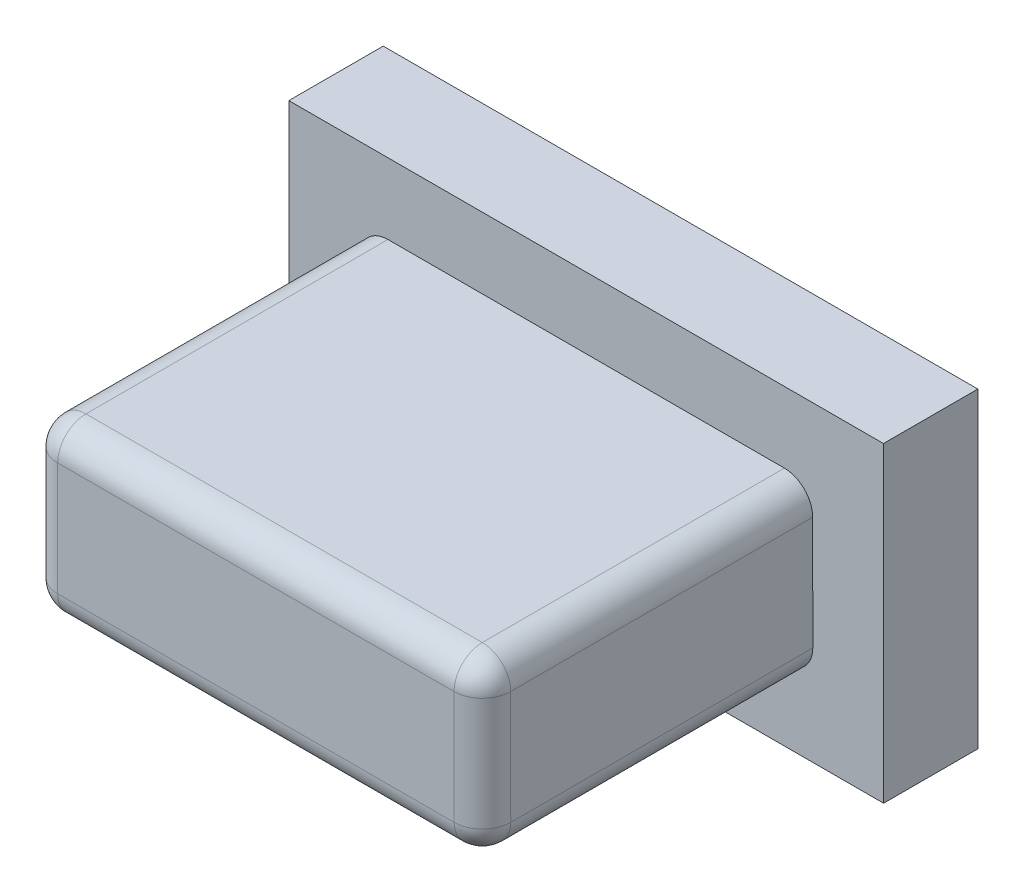
ISO-10303-21;
HEADER;
FILE_DESCRIPTION(('STEP AP214'),'2;1');
FILE_NAME('part.step','',(''),(''),'','','');
FILE_SCHEMA(('AUTOMOTIVE_DESIGN { 1 0 10303 214 1 1 1 1 }'));
ENDSEC;
DATA;
#1=APPLICATION_CONTEXT('core data for automotive mechanical design processes');
#2=APPLICATION_PROTOCOL_DEFINITION('international standard','automotive_design',2000,#1);
#3=PRODUCT_CONTEXT('',#1,'mechanical');
#4=PRODUCT('Part','Part','',(#3));
#5=PRODUCT_RELATED_PRODUCT_CATEGORY('part','',(#4));
#6=PRODUCT_DEFINITION_FORMATION('','',#4);
#7=PRODUCT_DEFINITION_CONTEXT('part definition',#1,'design');
#8=PRODUCT_DEFINITION('design','',#6,#7);
#9=PRODUCT_DEFINITION_SHAPE('','',#8);
#10=(LENGTH_UNIT() NAMED_UNIT(*) SI_UNIT(.MILLI.,.METRE.));
#11=(NAMED_UNIT(*) PLANE_ANGLE_UNIT() SI_UNIT($,.RADIAN.));
#12=(NAMED_UNIT(*) SI_UNIT($,.STERADIAN.) SOLID_ANGLE_UNIT());
#13=UNCERTAINTY_MEASURE_WITH_UNIT(LENGTH_MEASURE(1.E-05),#10,'distance_accuracy_value','');
#14=(GEOMETRIC_REPRESENTATION_CONTEXT(3) GLOBAL_UNCERTAINTY_ASSIGNED_CONTEXT((#13)) GLOBAL_UNIT_ASSIGNED_CONTEXT((#10,
#11,#12)) REPRESENTATION_CONTEXT('',''));
#15=CARTESIAN_POINT('',(0.,0.,0.));
#16=DIRECTION('',(0.,0.,1.));
#17=DIRECTION('',(1.,0.,0.));
#18=AXIS2_PLACEMENT_3D('',#15,#16,#17);
#19=CARTESIAN_POINT('',(0.,0.,1.));
#20=DIRECTION('',(0.,0.,-1.));
#21=DIRECTION('',(-1.,0.,0.));
#22=AXIS2_PLACEMENT_3D('',#19,#20,#21);
#23=PLANE('',#22);
#24=DIRECTION('',(-0.000542254772732639,0.99999985297987,0.));
#25=VECTOR('',#24,1.);
#26=CARTESIAN_POINT('',(0.186607772412947,-10.6499003768371,1.));
#27=LINE('',#26,#25);
#28=CARTESIAN_POINT('',(0.186607772412947,-10.6499003768371,1.));
#29=VERTEX_POINT('',#28);
#30=CARTESIAN_POINT('',(0.18481833166289,-7.34990086193107,1.));
#31=VERTEX_POINT('',#30);
#32=EDGE_CURVE('E218',#29,#31,#27,.T.);
#33=ORIENTED_EDGE('',*,*,#32,.F.);
#34=DIRECTION('',(-0.99999985297987,-0.000542254772732473,0.));
#35=VECTOR('',#34,1.);
#36=CARTESIAN_POINT('',(6.48660684621893,-10.6464841717689,1.));
#37=LINE('',#36,#35);
#38=CARTESIAN_POINT('',(6.48660684621893,-10.6464841717689,1.));
#39=VERTEX_POINT('',#38);
#40=EDGE_CURVE('E228',#39,#29,#37,.T.);
#41=ORIENTED_EDGE('',*,*,#40,.F.);
#42=DIRECTION('',(0.000542254772732761,-0.99999985297987,0.));
#43=VECTOR('',#42,1.);
#44=CARTESIAN_POINT('',(6.48481740546887,-7.34648465686284,1.));
#45=LINE('',#44,#43);
#46=CARTESIAN_POINT('',(6.48481740546887,-7.34648465686284,1.));
#47=VERTEX_POINT('',#46);
#48=EDGE_CURVE('E225',#47,#39,#45,.T.);
#49=ORIENTED_EDGE('',*,*,#48,.F.);
#50=DIRECTION('',(0.99999985297987,0.000542254772732886,0.));
#51=VECTOR('',#50,1.);
#52=CARTESIAN_POINT('',(0.18481833166289,-7.34990086193107,1.));
#53=LINE('',#52,#51);
#54=EDGE_CURVE('E221',#31,#47,#53,.T.);
#55=ORIENTED_EDGE('',*,*,#54,.F.);
#56=EDGE_LOOP('',(#33,#41,#49,#55));
#57=FACE_BOUND('',#56,.T.);
#58=DIRECTION('',(-0.000542254759999942,0.999999852979877,0.));
#59=VECTOR('',#58,1.);
#60=CARTESIAN_POINT('',(5.73620026534603,-9.896890973178,1.));
#61=LINE('',#60,#59);
#62=CARTESIAN_POINT('',(5.73603758891803,-9.59689101728404,1.));
#63=VERTEX_POINT('',#62);
#64=CARTESIAN_POINT('',(5.73538688320601,-8.39689119366795,1.));
#65=VERTEX_POINT('',#64);
#66=EDGE_CURVE('E203',#63,#65,#61,.T.);
#67=ORIENTED_EDGE('',*,*,#66,.F.);
#68=CARTESIAN_POINT('',(5.43603763302407,-9.59705369371204,1.));
#69=DIRECTION('',(0.,0.,-1.));
#70=DIRECTION('',(-1.,0.,0.));
#71=AXIS2_PLACEMENT_3D('',#68,#69,#70);
#72=CIRCLE('',#71,0.3);
#73=CARTESIAN_POINT('',(5.43620030945207,-9.897053649606,1.));
#74=VERTEX_POINT('',#73);
#75=EDGE_CURVE('E45',#63,#74,#72,.T.);
#76=ORIENTED_EDGE('',*,*,#75,.T.);
#77=DIRECTION('',(0.999999852979877,0.000542254759999707,0.));
#78=VECTOR('',#77,1.);
#79=CARTESIAN_POINT('',(0.936200971042009,-9.899493796026,1.));
#80=LINE('',#79,#78);
#81=CARTESIAN_POINT('',(1.23620092693597,-9.899331119598,1.));
#82=VERTEX_POINT('',#81);
#83=EDGE_CURVE('E215',#82,#74,#80,.T.);
#84=ORIENTED_EDGE('',*,*,#83,.F.);
#85=CARTESIAN_POINT('',(1.23603825050797,-9.59933116370404,1.));
#86=DIRECTION('',(0.,0.,-1.));
#87=DIRECTION('',(-1.,0.,0.));
#88=AXIS2_PLACEMENT_3D('',#85,#86,#87);
#89=CIRCLE('',#88,0.3);
#90=CARTESIAN_POINT('',(0.936038294614009,-9.59949384013204,1.));
#91=VERTEX_POINT('',#90);
#92=EDGE_CURVE('E11',#82,#91,#89,.T.);
#93=ORIENTED_EDGE('',*,*,#92,.T.);
#94=DIRECTION('',(0.000542254759999822,-0.999999852979877,0.));
#95=VECTOR('',#94,1.);
#96=CARTESIAN_POINT('',(0.935224912473988,-8.09949406062199,1.));
#97=LINE('',#96,#95);
#98=CARTESIAN_POINT('',(0.935387588901987,-8.39949401651595,1.));
#99=VERTEX_POINT('',#98);
#100=EDGE_CURVE('E212',#99,#91,#97,.T.);
#101=ORIENTED_EDGE('',*,*,#100,.F.);
#102=CARTESIAN_POINT('',(1.23538754479595,-8.39933134008795,1.));
#103=DIRECTION('',(0.,0.,-1.));
#104=DIRECTION('',(-1.,0.,0.));
#105=AXIS2_PLACEMENT_3D('',#102,#103,#104);
#106=CIRCLE('',#105,0.3);
#107=CARTESIAN_POINT('',(1.23522486836795,-8.09933138419399,1.));
#108=VERTEX_POINT('',#107);
#109=EDGE_CURVE('E307',#99,#108,#106,.T.);
#110=ORIENTED_EDGE('',*,*,#109,.T.);
#111=DIRECTION('',(-0.999999852979877,-0.000542254760000068,0.));
#112=VECTOR('',#111,1.);
#113=CARTESIAN_POINT('',(5.73522420677801,-8.09689123777399,1.));
#114=LINE('',#113,#112);
#115=CARTESIAN_POINT('',(5.43522425088405,-8.09705391420199,1.));
#116=VERTEX_POINT('',#115);
#117=EDGE_CURVE('E209',#116,#108,#114,.T.);
#118=ORIENTED_EDGE('',*,*,#117,.F.);
#119=CARTESIAN_POINT('',(5.43538692731205,-8.39705387009595,1.));
#120=DIRECTION('',(0.,0.,-1.));
#121=DIRECTION('',(-1.,0.,0.));
#122=AXIS2_PLACEMENT_3D('',#119,#120,#121);
#123=CIRCLE('',#122,0.3);
#124=EDGE_CURVE('E309',#116,#65,#123,.T.);
#125=ORIENTED_EDGE('',*,*,#124,.T.);
#126=EDGE_LOOP('',(#67,#76,#84,#93,#101,#110,#118,#125));
#127=FACE_BOUND('',#126,.T.);
#128=ADVANCED_FACE('F36',(#57,#127),#23,.F.);
#129=CARTESIAN_POINT('',(0.186607772412947,-10.6499003768371,1.));
#130=DIRECTION('',(-0.99999985297987,-0.000542254772732639,0.));
#131=DIRECTION('',(0.000542254772732639,-0.99999985297987,0.));
#132=AXIS2_PLACEMENT_3D('',#129,#130,#131);
#133=PLANE('',#132);
#134=DIRECTION('',(-0.000542254772732639,0.99999985297987,0.));
#135=VECTOR('',#134,1.);
#136=CARTESIAN_POINT('',(0.186607772412947,-10.6499003768371,0.));
#137=LINE('',#136,#135);
#138=CARTESIAN_POINT('',(0.186607772412947,-10.6499003768371,0.));
#139=VERTEX_POINT('',#138);
#140=CARTESIAN_POINT('',(0.18481833166289,-7.34990086193107,0.));
#141=VERTEX_POINT('',#140);
#142=EDGE_CURVE('E217',#139,#141,#137,.T.);
#143=ORIENTED_EDGE('',*,*,#142,.F.);
#144=DIRECTION('',(0.,0.,-1.));
#145=VECTOR('',#144,1.);
#146=CARTESIAN_POINT('',(0.186607772412947,-10.6499003768371,1.));
#147=LINE('',#146,#145);
#148=EDGE_CURVE('E242',#29,#139,#147,.T.);
#149=ORIENTED_EDGE('',*,*,#148,.F.);
#150=ORIENTED_EDGE('',*,*,#32,.T.);
#151=DIRECTION('',(0.,0.,-1.));
#152=VECTOR('',#151,1.);
#153=CARTESIAN_POINT('',(0.18481833166289,-7.34990086193107,1.));
#154=LINE('',#153,#152);
#155=EDGE_CURVE('E231',#31,#141,#154,.T.);
#156=ORIENTED_EDGE('',*,*,#155,.T.);
#157=EDGE_LOOP('',(#143,#149,#150,#156));
#158=FACE_BOUND('',#157,.T.);
#159=ADVANCED_FACE('F387',(#158),#133,.T.);
#160=CARTESIAN_POINT('',(6.48660684621893,-10.6464841717689,1.));
#161=DIRECTION('',(0.000542254772732473,-0.99999985297987,0.));
#162=DIRECTION('',(0.99999985297987,0.000542254772732473,0.));
#163=AXIS2_PLACEMENT_3D('',#160,#161,#162);
#164=PLANE('',#163);
#165=DIRECTION('',(-0.99999985297987,-0.000542254772732473,0.));
#166=VECTOR('',#165,1.);
#167=CARTESIAN_POINT('',(6.48660684621893,-10.6464841717689,0.));
#168=LINE('',#167,#166);
#169=CARTESIAN_POINT('',(6.48660684621893,-10.6464841717689,0.));
#170=VERTEX_POINT('',#169);
#171=EDGE_CURVE('E222',#170,#139,#168,.T.);
#172=ORIENTED_EDGE('',*,*,#171,.F.);
#173=DIRECTION('',(0.,0.,-1.));
#174=VECTOR('',#173,1.);
#175=CARTESIAN_POINT('',(6.48660684621893,-10.6464841717689,1.));
#176=LINE('',#175,#174);
#177=EDGE_CURVE('E245',#39,#170,#176,.T.);
#178=ORIENTED_EDGE('',*,*,#177,.F.);
#179=ORIENTED_EDGE('',*,*,#40,.T.);
#180=ORIENTED_EDGE('',*,*,#148,.T.);
#181=EDGE_LOOP('',(#172,#178,#179,#180));
#182=FACE_BOUND('',#181,.T.);
#183=ADVANCED_FACE('F393',(#182),#164,.T.);
#184=CARTESIAN_POINT('',(6.48481740546887,-7.34648465686284,1.));
#185=DIRECTION('',(0.99999985297987,0.000542254772732762,0.));
#186=DIRECTION('',(-0.000542254772732762,0.99999985297987,0.));
#187=AXIS2_PLACEMENT_3D('',#184,#185,#186);
#188=PLANE('',#187);
#189=DIRECTION('',(0.000542254772732761,-0.99999985297987,0.));
#190=VECTOR('',#189,1.);
#191=CARTESIAN_POINT('',(6.48481740546887,-7.34648465686284,0.));
#192=LINE('',#191,#190);
#193=CARTESIAN_POINT('',(6.48481740546887,-7.34648465686284,0.));
#194=VERTEX_POINT('',#193);
#195=EDGE_CURVE('E237',#194,#170,#192,.T.);
#196=ORIENTED_EDGE('',*,*,#195,.F.);
#197=DIRECTION('',(0.,0.,-1.));
#198=VECTOR('',#197,1.);
#199=CARTESIAN_POINT('',(6.48481740546887,-7.34648465686284,1.));
#200=LINE('',#199,#198);
#201=EDGE_CURVE('E247',#47,#194,#200,.T.);
#202=ORIENTED_EDGE('',*,*,#201,.F.);
#203=ORIENTED_EDGE('',*,*,#48,.T.);
#204=ORIENTED_EDGE('',*,*,#177,.T.);
#205=EDGE_LOOP('',(#196,#202,#203,#204));
#206=FACE_BOUND('',#205,.T.);
#207=ADVANCED_FACE('F408',(#206),#188,.T.);
#208=CARTESIAN_POINT('',(0.18481833166289,-7.34990086193107,1.));
#209=DIRECTION('',(-0.000542254772732886,0.99999985297987,0.));
#210=DIRECTION('',(-0.99999985297987,-0.000542254772732886,0.));
#211=AXIS2_PLACEMENT_3D('',#208,#209,#210);
#212=PLANE('',#211);
#213=DIRECTION('',(0.99999985297987,0.000542254772732886,0.));
#214=VECTOR('',#213,1.);
#215=CARTESIAN_POINT('',(0.18481833166289,-7.34990086193107,0.));
#216=LINE('',#215,#214);
#217=EDGE_CURVE('E234',#141,#194,#216,.T.);
#218=ORIENTED_EDGE('',*,*,#217,.F.);
#219=ORIENTED_EDGE('',*,*,#155,.F.);
#220=ORIENTED_EDGE('',*,*,#54,.T.);
#221=ORIENTED_EDGE('',*,*,#201,.T.);
#222=EDGE_LOOP('',(#218,#219,#220,#221));
#223=FACE_BOUND('',#222,.T.);
#224=ADVANCED_FACE('F404',(#223),#212,.T.);
#225=CARTESIAN_POINT('',(0.,0.,0.));
#226=DIRECTION('',(0.,0.,-1.));
#227=DIRECTION('',(-1.,0.,0.));
#228=AXIS2_PLACEMENT_3D('',#225,#226,#227);
#229=PLANE('',#228);
#230=DIRECTION('',(0.999999852979877,0.000542254760000085,0.));
#231=VECTOR('',#230,1.);
#232=CARTESIAN_POINT('',(5.8351699666,-7.996837027,0.));
#233=LINE('',#232,#231);
#234=CARTESIAN_POINT('',(0.8351707017,-7.9995483008,0.));
#235=VERTEX_POINT('',#234);
#236=CARTESIAN_POINT('',(5.8351699666,-7.996837027,0.));
#237=VERTEX_POINT('',#236);
#238=EDGE_CURVE('E170',#235,#237,#233,.T.);
#239=ORIENTED_EDGE('',*,*,#238,.F.);
#240=DIRECTION('',(-0.000542254749989126,0.999999852979882,0.));
#241=VECTOR('',#240,1.);
#242=CARTESIAN_POINT('',(0.8351707017,-7.9995483008,0.));
#243=LINE('',#242,#241);
#244=CARTESIAN_POINT('',(0.8362552112,-9.9995480068,0.));
#245=VERTEX_POINT('',#244);
#246=EDGE_CURVE('E187',#245,#235,#243,.T.);
#247=ORIENTED_EDGE('',*,*,#246,.F.);
#248=DIRECTION('',(-0.999999852979877,-0.000542254759999738,0.));
#249=VECTOR('',#248,1.);
#250=CARTESIAN_POINT('',(0.8362552112,-9.9995480068,0.));
#251=LINE('',#250,#249);
#252=CARTESIAN_POINT('',(5.8362544761,-9.996836733,0.));
#253=VERTEX_POINT('',#252);
#254=EDGE_CURVE('E190',#253,#245,#251,.T.);
#255=ORIENTED_EDGE('',*,*,#254,.F.);
#256=DIRECTION('',(0.000542254749988909,-0.999999852979882,0.));
#257=VECTOR('',#256,1.);
#258=CARTESIAN_POINT('',(5.8362544761,-9.996836733,0.));
#259=LINE('',#258,#257);
#260=EDGE_CURVE('E196',#237,#253,#259,.T.);
#261=ORIENTED_EDGE('',*,*,#260,.F.);
#262=EDGE_LOOP('',(#239,#247,#255,#261));
#263=FACE_BOUND('',#262,.T.);
#264=ORIENTED_EDGE('',*,*,#142,.T.);
#265=ORIENTED_EDGE('',*,*,#217,.T.);
#266=ORIENTED_EDGE('',*,*,#195,.T.);
#267=ORIENTED_EDGE('',*,*,#171,.T.);
#268=EDGE_LOOP('',(#264,#265,#266,#267));
#269=FACE_BOUND('',#268,.T.);
#270=ADVANCED_FACE('F401',(#263,#269),#229,.T.);
#271=CARTESIAN_POINT('',(5.73620026534603,-9.896890973178,3.));
#272=DIRECTION('',(-0.999999852979877,-0.000542254759999942,0.));
#273=DIRECTION('',(0.000542254759999942,-0.999999852979877,0.));
#274=AXIS2_PLACEMENT_3D('',#271,#272,#273);
#275=PLANE('',#274);
#276=ORIENTED_EDGE('',*,*,#66,.T.);
#277=DIRECTION('',(0.,0.,-1.));
#278=VECTOR('',#277,1.);
#279=CARTESIAN_POINT('',(5.73538688320601,-8.39689119366795,3.));
#280=LINE('',#279,#278);
#281=CARTESIAN_POINT('',(5.73538688320601,-8.39689119366795,4.2));
#282=VERTEX_POINT('',#281);
#283=EDGE_CURVE('E302',#65,#282,#280,.F.);
#284=ORIENTED_EDGE('',*,*,#283,.T.);
#285=DIRECTION('',(-0.000542254759999942,0.999999852979877,0.));
#286=VECTOR('',#285,1.);
#287=CARTESIAN_POINT('',(5.73620026534603,-9.89689097317801,4.2));
#288=LINE('',#287,#286);
#289=CARTESIAN_POINT('',(5.73603758891803,-9.59689101728404,4.2));
#290=VERTEX_POINT('',#289);
#291=EDGE_CURVE('E263',#282,#290,#288,.F.);
#292=ORIENTED_EDGE('',*,*,#291,.T.);
#293=DIRECTION('',(0.,0.,-1.));
#294=VECTOR('',#293,1.);
#295=CARTESIAN_POINT('',(5.73603758891803,-9.59689101728404,3.));
#296=LINE('',#295,#294);
#297=EDGE_CURVE('E300',#290,#63,#296,.T.);
#298=ORIENTED_EDGE('',*,*,#297,.T.);
#299=EDGE_LOOP('',(#276,#284,#292,#298));
#300=FACE_BOUND('',#299,.T.);
#301=ADVANCED_FACE('F399',(#300),#275,.F.);
#302=CARTESIAN_POINT('',(5.73522420677801,-8.09689123777399,3.));
#303=DIRECTION('',(0.000542254760000068,-0.999999852979877,0.));
#304=DIRECTION('',(0.999999852979877,0.000542254760000068,0.));
#305=AXIS2_PLACEMENT_3D('',#302,#303,#304);
#306=PLANE('',#305);
#307=ORIENTED_EDGE('',*,*,#117,.T.);
#308=DIRECTION('',(0.,0.,-1.));
#309=VECTOR('',#308,1.);
#310=CARTESIAN_POINT('',(1.23522486836795,-8.09933138419399,3.));
#311=LINE('',#310,#309);
#312=CARTESIAN_POINT('',(1.23522486836795,-8.09933138419399,4.2));
#313=VERTEX_POINT('',#312);
#314=EDGE_CURVE('E298',#108,#313,#311,.F.);
#315=ORIENTED_EDGE('',*,*,#314,.T.);
#316=DIRECTION('',(-0.999999852979877,-0.000542254760000068,0.));
#317=VECTOR('',#316,1.);
#318=CARTESIAN_POINT('',(5.73522420677801,-8.09689123777399,4.2));
#319=LINE('',#318,#317);
#320=CARTESIAN_POINT('',(5.43522425088405,-8.09705391420199,4.2));
#321=VERTEX_POINT('',#320);
#322=EDGE_CURVE('E266',#313,#321,#319,.F.);
#323=ORIENTED_EDGE('',*,*,#322,.T.);
#324=DIRECTION('',(0.,0.,-1.));
#325=VECTOR('',#324,1.);
#326=CARTESIAN_POINT('',(5.43522425088405,-8.09705391420199,3.));
#327=LINE('',#326,#325);
#328=EDGE_CURVE('E296',#321,#116,#327,.T.);
#329=ORIENTED_EDGE('',*,*,#328,.T.);
#330=EDGE_LOOP('',(#307,#315,#323,#329));
#331=FACE_BOUND('',#330,.T.);
#332=ADVANCED_FACE('F366',(#331),#306,.F.);
#333=CARTESIAN_POINT('',(0.935224912473988,-8.09949406062199,3.));
#334=DIRECTION('',(0.999999852979877,0.000542254759999822,0.));
#335=DIRECTION('',(-0.000542254759999822,0.999999852979877,0.));
#336=AXIS2_PLACEMENT_3D('',#333,#334,#335);
#337=PLANE('',#336);
#338=DIRECTION('',(0.000542254759999822,-0.999999852979877,0.));
#339=VECTOR('',#338,1.);
#340=CARTESIAN_POINT('',(0.935224912473988,-8.09949406062199,4.2));
#341=LINE('',#340,#339);
#342=CARTESIAN_POINT('',(0.936038294614009,-9.59949384013204,4.2));
#343=VERTEX_POINT('',#342);
#344=CARTESIAN_POINT('',(0.935387588901987,-8.39949401651595,4.2));
#345=VERTEX_POINT('',#344);
#346=EDGE_CURVE('E269',#343,#345,#341,.F.);
#347=ORIENTED_EDGE('',*,*,#346,.T.);
#348=DIRECTION('',(0.,0.,-1.));
#349=VECTOR('',#348,1.);
#350=CARTESIAN_POINT('',(0.935387588901987,-8.39949401651595,3.));
#351=LINE('',#350,#349);
#352=EDGE_CURVE('E294',#345,#99,#351,.T.);
#353=ORIENTED_EDGE('',*,*,#352,.T.);
#354=ORIENTED_EDGE('',*,*,#100,.T.);
#355=DIRECTION('',(0.,0.,-1.));
#356=VECTOR('',#355,1.);
#357=CARTESIAN_POINT('',(0.936038294614009,-9.59949384013204,3.));
#358=LINE('',#357,#356);
#359=EDGE_CURVE('E292',#91,#343,#358,.F.);
#360=ORIENTED_EDGE('',*,*,#359,.T.);
#361=EDGE_LOOP('',(#347,#353,#354,#360));
#362=FACE_BOUND('',#361,.T.);
#363=ADVANCED_FACE('F362',(#362),#337,.F.);
#364=CARTESIAN_POINT('',(0.936200971042009,-9.899493796026,3.));
#365=DIRECTION('',(-0.000542254759999707,0.999999852979877,0.));
#366=DIRECTION('',(-0.999999852979877,-0.000542254759999707,0.));
#367=AXIS2_PLACEMENT_3D('',#364,#365,#366);
#368=PLANE('',#367);
#369=ORIENTED_EDGE('',*,*,#83,.T.);
#370=DIRECTION('',(0.,0.,-1.));
#371=VECTOR('',#370,1.);
#372=CARTESIAN_POINT('',(5.43620030945207,-9.897053649606,3.));
#373=LINE('',#372,#371);
#374=CARTESIAN_POINT('',(5.43620030945207,-9.897053649606,4.2));
#375=VERTEX_POINT('',#374);
#376=EDGE_CURVE('E305',#74,#375,#373,.F.);
#377=ORIENTED_EDGE('',*,*,#376,.T.);
#378=DIRECTION('',(0.999999852979877,0.000542254759999707,0.));
#379=VECTOR('',#378,1.);
#380=CARTESIAN_POINT('',(0.936200971042009,-9.899493796026,4.2));
#381=LINE('',#380,#379);
#382=CARTESIAN_POINT('',(1.23620092693597,-9.899331119598,4.2));
#383=VERTEX_POINT('',#382);
#384=EDGE_CURVE('E261',#375,#383,#381,.F.);
#385=ORIENTED_EDGE('',*,*,#384,.T.);
#386=DIRECTION('',(0.,0.,-1.));
#387=VECTOR('',#386,1.);
#388=CARTESIAN_POINT('',(1.23620092693597,-9.899331119598,3.));
#389=LINE('',#388,#387);
#390=EDGE_CURVE('E59',#383,#82,#389,.T.);
#391=ORIENTED_EDGE('',*,*,#390,.T.);
#392=EDGE_LOOP('',(#369,#377,#385,#391));
#393=FACE_BOUND('',#392,.T.);
#394=ADVANCED_FACE('F332',(#393),#368,.F.);
#395=CARTESIAN_POINT('',(5.8351699666,-7.996837027,0.2));
#396=DIRECTION('',(-0.000542254760000085,0.999999852979877,0.));
#397=DIRECTION('',(-0.999999852979877,-0.000542254760000085,0.));
#398=AXIS2_PLACEMENT_3D('',#395,#396,#397);
#399=PLANE('',#398);
#400=ORIENTED_EDGE('',*,*,#238,.T.);
#401=DIRECTION('',(0.,0.,-1.));
#402=VECTOR('',#401,1.);
#403=CARTESIAN_POINT('',(5.8351699666,-7.996837027,0.2));
#404=LINE('',#403,#402);
#405=CARTESIAN_POINT('',(5.8351699666,-7.996837027,0.2));
#406=VERTEX_POINT('',#405);
#407=EDGE_CURVE('E163',#406,#237,#404,.T.);
#408=ORIENTED_EDGE('',*,*,#407,.F.);
#409=DIRECTION('',(0.999999852979877,0.000542254760000085,0.));
#410=VECTOR('',#409,1.);
#411=CARTESIAN_POINT('',(5.8351699666,-7.996837027,0.2));
#412=LINE('',#411,#410);
#413=CARTESIAN_POINT('',(0.8351707017,-7.9995483008,0.2));
#414=VERTEX_POINT('',#413);
#415=EDGE_CURVE('E167',#414,#406,#412,.T.);
#416=ORIENTED_EDGE('',*,*,#415,.F.);
#417=DIRECTION('',(0.,0.,-1.));
#418=VECTOR('',#417,1.);
#419=CARTESIAN_POINT('',(0.8351707017,-7.9995483008,0.2));
#420=LINE('',#419,#418);
#421=EDGE_CURVE('E201',#414,#235,#420,.T.);
#422=ORIENTED_EDGE('',*,*,#421,.T.);
#423=EDGE_LOOP('',(#400,#408,#416,#422));
#424=FACE_BOUND('',#423,.T.);
#425=ADVANCED_FACE('F165',(#424),#399,.F.);
#426=CARTESIAN_POINT('',(0.8351707017,-7.9995483008,0.2));
#427=DIRECTION('',(-0.999999852979882,-0.000542254749989126,0.));
#428=DIRECTION('',(0.000542254749989126,-0.999999852979882,0.));
#429=AXIS2_PLACEMENT_3D('',#426,#427,#428);
#430=PLANE('',#429);
#431=ORIENTED_EDGE('',*,*,#246,.T.);
#432=ORIENTED_EDGE('',*,*,#421,.F.);
#433=DIRECTION('',(-0.000542254749989126,0.999999852979882,0.));
#434=VECTOR('',#433,1.);
#435=CARTESIAN_POINT('',(0.8351707017,-7.9995483008,0.2));
#436=LINE('',#435,#434);
#437=CARTESIAN_POINT('',(0.8362552112,-9.9995480068,0.2));
#438=VERTEX_POINT('',#437);
#439=EDGE_CURVE('E175',#438,#414,#436,.T.);
#440=ORIENTED_EDGE('',*,*,#439,.F.);
#441=DIRECTION('',(0.,0.,-1.));
#442=VECTOR('',#441,1.);
#443=CARTESIAN_POINT('',(0.8362552112,-9.9995480068,0.2));
#444=LINE('',#443,#442);
#445=EDGE_CURVE('E204',#438,#245,#444,.T.);
#446=ORIENTED_EDGE('',*,*,#445,.T.);
#447=EDGE_LOOP('',(#431,#432,#440,#446));
#448=FACE_BOUND('',#447,.T.);
#449=ADVANCED_FACE('F577',(#448),#430,.F.);
#450=CARTESIAN_POINT('',(0.8362552112,-9.9995480068,0.2));
#451=DIRECTION('',(0.000542254759999738,-0.999999852979877,0.));
#452=DIRECTION('',(0.999999852979877,0.000542254759999738,0.));
#453=AXIS2_PLACEMENT_3D('',#450,#451,#452);
#454=PLANE('',#453);
#455=ORIENTED_EDGE('',*,*,#254,.T.);
#456=ORIENTED_EDGE('',*,*,#445,.F.);
#457=DIRECTION('',(-0.999999852979877,-0.000542254759999738,0.));
#458=VECTOR('',#457,1.);
#459=CARTESIAN_POINT('',(0.8362552112,-9.9995480068,0.2));
#460=LINE('',#459,#458);
#461=CARTESIAN_POINT('',(5.8362544761,-9.996836733,0.2));
#462=VERTEX_POINT('',#461);
#463=EDGE_CURVE('E183',#462,#438,#460,.T.);
#464=ORIENTED_EDGE('',*,*,#463,.F.);
#465=DIRECTION('',(0.,0.,-1.));
#466=VECTOR('',#465,1.);
#467=CARTESIAN_POINT('',(5.8362544761,-9.996836733,0.2));
#468=LINE('',#467,#466);
#469=EDGE_CURVE('E174',#462,#253,#468,.T.);
#470=ORIENTED_EDGE('',*,*,#469,.T.);
#471=EDGE_LOOP('',(#455,#456,#464,#470));
#472=FACE_BOUND('',#471,.T.);
#473=ADVANCED_FACE('F569',(#472),#454,.F.);
#474=CARTESIAN_POINT('',(5.8362544761,-9.996836733,0.2));
#475=DIRECTION('',(0.999999852979882,0.000542254749988909,0.));
#476=DIRECTION('',(-0.000542254749988909,0.999999852979882,0.));
#477=AXIS2_PLACEMENT_3D('',#474,#475,#476);
#478=PLANE('',#477);
#479=ORIENTED_EDGE('',*,*,#260,.T.);
#480=ORIENTED_EDGE('',*,*,#469,.F.);
#481=DIRECTION('',(0.000542254749988909,-0.999999852979882,0.));
#482=VECTOR('',#481,1.);
#483=CARTESIAN_POINT('',(5.8362544761,-9.996836733,0.2));
#484=LINE('',#483,#482);
#485=EDGE_CURVE('E178',#406,#462,#484,.T.);
#486=ORIENTED_EDGE('',*,*,#485,.F.);
#487=ORIENTED_EDGE('',*,*,#407,.T.);
#488=EDGE_LOOP('',(#479,#480,#486,#487));
#489=FACE_BOUND('',#488,.T.);
#490=ADVANCED_FACE('F179',(#489),#478,.F.);
#491=CARTESIAN_POINT('',(0.,0.,0.2));
#492=DIRECTION('',(0.,0.,1.));
#493=DIRECTION('',(1.,0.,0.));
#494=AXIS2_PLACEMENT_3D('',#491,#492,#493);
#495=PLANE('',#494);
#496=ORIENTED_EDGE('',*,*,#415,.T.);
#497=ORIENTED_EDGE('',*,*,#485,.T.);
#498=ORIENTED_EDGE('',*,*,#463,.T.);
#499=ORIENTED_EDGE('',*,*,#439,.T.);
#500=EDGE_LOOP('',(#496,#497,#498,#499));
#501=FACE_BOUND('',#500,.T.);
#502=ADVANCED_FACE('F185',(#501),#495,.F.);
#503=CARTESIAN_POINT('',(0.,0.,4.5));
#504=DIRECTION('',(0.,0.,1.));
#505=DIRECTION('',(1.,0.,0.));
#506=AXIS2_PLACEMENT_3D('',#503,#504,#505);
#507=PLANE('',#506);
#508=DIRECTION('',(0.000542254759999822,-0.999999852979877,0.));
#509=VECTOR('',#508,1.);
#510=CARTESIAN_POINT('',(1.23620092693597,-9.89933111959801,4.5));
#511=LINE('',#510,#509);
#512=CARTESIAN_POINT('',(1.23538754479595,-8.39933134008795,4.5));
#513=VERTEX_POINT('',#512);
#514=CARTESIAN_POINT('',(1.23603825050797,-9.59933116370404,4.5));
#515=VERTEX_POINT('',#514);
#516=EDGE_CURVE('E244',#513,#515,#511,.T.);
#517=ORIENTED_EDGE('',*,*,#516,.T.);
#518=DIRECTION('',(0.999999852979877,0.000542254759999707,0.));
#519=VECTOR('',#518,1.);
#520=CARTESIAN_POINT('',(5.73603758891803,-9.59689101728404,4.5));
#521=LINE('',#520,#519);
#522=CARTESIAN_POINT('',(5.43603763302407,-9.59705369371204,4.5));
#523=VERTEX_POINT('',#522);
#524=EDGE_CURVE('E258',#515,#523,#521,.T.);
#525=ORIENTED_EDGE('',*,*,#524,.T.);
#526=DIRECTION('',(-0.000542254759999942,0.999999852979877,0.));
#527=VECTOR('',#526,1.);
#528=CARTESIAN_POINT('',(5.43522425088405,-8.09705391420199,4.5));
#529=LINE('',#528,#527);
#530=CARTESIAN_POINT('',(5.43538692731205,-8.39705387009595,4.5));
#531=VERTEX_POINT('',#530);
#532=EDGE_CURVE('E255',#523,#531,#529,.T.);
#533=ORIENTED_EDGE('',*,*,#532,.T.);
#534=DIRECTION('',(-0.999999852979877,-0.000542254760000068,0.));
#535=VECTOR('',#534,1.);
#536=CARTESIAN_POINT('',(0.935387588901988,-8.39949401651595,4.5));
#537=LINE('',#536,#535);
#538=EDGE_CURVE('E252',#531,#513,#537,.T.);
#539=ORIENTED_EDGE('',*,*,#538,.T.);
#540=EDGE_LOOP('',(#517,#525,#533,#539));
#541=FACE_BOUND('',#540,.T.);
#542=ADVANCED_FACE('F345',(#541),#507,.T.);
#543=CARTESIAN_POINT('',(0.00455493998399723,-8.3999987650248,4.2));
#544=DIRECTION('',(0.999999852979877,0.000542254760000068,0.));
#545=DIRECTION('',(-0.000542254760000068,0.999999852979877,0.));
#546=AXIS2_PLACEMENT_3D('',#543,#544,#545);
#547=CYLINDRICAL_SURFACE('',#546,0.3);
#548=ORIENTED_EDGE('',*,*,#322,.F.);
#549=CARTESIAN_POINT('',(1.23538754479595,-8.39933134008795,4.2));
#550=DIRECTION('',(0.999999852979877,0.000542254760000068,0.));
#551=DIRECTION('',(-0.000542254760000068,0.999999852979877,0.));
#552=AXIS2_PLACEMENT_3D('',#549,#550,#551);
#553=CIRCLE('',#552,0.3);
#554=EDGE_CURVE('E279',#313,#513,#553,.T.);
#555=ORIENTED_EDGE('',*,*,#554,.T.);
#556=ORIENTED_EDGE('',*,*,#538,.F.);
#557=CARTESIAN_POINT('',(5.43538692731205,-8.39705387009595,4.2));
#558=DIRECTION('',(0.999999852979877,0.000542254760000068,0.));
#559=DIRECTION('',(-0.000542254760000068,0.999999852979877,0.));
#560=AXIS2_PLACEMENT_3D('',#557,#558,#559);
#561=CIRCLE('',#560,0.3);
#562=EDGE_CURVE('E277',#531,#321,#561,.F.);
#563=ORIENTED_EDGE('',*,*,#562,.T.);
#564=EDGE_LOOP('',(#548,#555,#556,#563));
#565=FACE_BOUND('',#564,.T.);
#566=ADVANCED_FACE('F376',(#565),#547,.T.);
#567=CARTESIAN_POINT('',(1.23083260481196,0.000667424936847159,4.2));
#568=DIRECTION('',(-0.000542254759999822,0.999999852979877,0.));
#569=DIRECTION('',(-0.999999852979877,-0.000542254759999822,0.));
#570=AXIS2_PLACEMENT_3D('',#567,#568,#569);
#571=CYLINDRICAL_SURFACE('',#570,0.3);
#572=ORIENTED_EDGE('',*,*,#516,.F.);
#573=CARTESIAN_POINT('',(1.23538754479595,-8.39933134008795,4.2));
#574=DIRECTION('',(-0.000542254759999822,0.999999852979877,0.));
#575=DIRECTION('',(-0.999999852979877,-0.000542254759999822,0.));
#576=AXIS2_PLACEMENT_3D('',#573,#574,#575);
#577=CIRCLE('',#576,0.3);
#578=EDGE_CURVE('E274',#513,#345,#577,.F.);
#579=ORIENTED_EDGE('',*,*,#578,.T.);
#580=ORIENTED_EDGE('',*,*,#346,.F.);
#581=CARTESIAN_POINT('',(1.23603825050797,-9.59933116370404,4.2));
#582=DIRECTION('',(-0.000542254759999822,0.999999852979877,0.));
#583=DIRECTION('',(-0.999999852979877,-0.000542254759999822,0.));
#584=AXIS2_PLACEMENT_3D('',#581,#582,#583);
#585=CIRCLE('',#584,0.3);
#586=EDGE_CURVE('E272',#343,#515,#585,.T.);
#587=ORIENTED_EDGE('',*,*,#586,.T.);
#588=EDGE_LOOP('',(#572,#579,#580,#587));
#589=FACE_BOUND('',#588,.T.);
#590=ADVANCED_FACE('F349',(#589),#571,.T.);
#591=CARTESIAN_POINT('',(5.43083198732805,0.0029448949288474,4.2));
#592=DIRECTION('',(0.000542254759999942,-0.999999852979877,0.));
#593=DIRECTION('',(0.999999852979877,0.000542254759999942,0.));
#594=AXIS2_PLACEMENT_3D('',#591,#592,#593);
#595=CYLINDRICAL_SURFACE('',#594,0.3);
#596=ORIENTED_EDGE('',*,*,#291,.F.);
#597=CARTESIAN_POINT('',(5.43538692731205,-8.39705387009595,4.2));
#598=DIRECTION('',(0.000542254759999942,-0.999999852979877,0.));
#599=DIRECTION('',(0.999999852979877,0.000542254759999942,0.));
#600=AXIS2_PLACEMENT_3D('',#597,#598,#599);
#601=CIRCLE('',#600,0.3);
#602=EDGE_CURVE('E283',#282,#531,#601,.T.);
#603=ORIENTED_EDGE('',*,*,#602,.T.);
#604=ORIENTED_EDGE('',*,*,#532,.F.);
#605=CARTESIAN_POINT('',(5.43603763302407,-9.59705369371204,4.2));
#606=DIRECTION('',(0.000542254759999942,-0.999999852979877,0.));
#607=DIRECTION('',(0.999999852979877,0.000542254759999942,0.));
#608=AXIS2_PLACEMENT_3D('',#605,#606,#607);
#609=CIRCLE('',#608,0.3);
#610=EDGE_CURVE('E281',#523,#290,#609,.F.);
#611=ORIENTED_EDGE('',*,*,#610,.T.);
#612=EDGE_LOOP('',(#596,#603,#604,#611));
#613=FACE_BOUND('',#612,.T.);
#614=ADVANCED_FACE('F341',(#613),#595,.T.);
#615=CARTESIAN_POINT('',(0.00520564569601566,-9.59999858864089,4.2));
#616=DIRECTION('',(-0.999999852979877,-0.000542254759999707,0.));
#617=DIRECTION('',(0.000542254759999707,-0.999999852979877,0.));
#618=AXIS2_PLACEMENT_3D('',#615,#616,#617);
#619=CYLINDRICAL_SURFACE('',#618,0.3);
#620=ORIENTED_EDGE('',*,*,#384,.F.);
#621=CARTESIAN_POINT('',(5.43603763302407,-9.59705369371204,4.2));
#622=DIRECTION('',(-0.999999852979877,-0.000542254759999707,0.));
#623=DIRECTION('',(0.000542254759999707,-0.999999852979877,0.));
#624=AXIS2_PLACEMENT_3D('',#621,#622,#623);
#625=CIRCLE('',#624,0.3);
#626=EDGE_CURVE('E289',#375,#523,#625,.T.);
#627=ORIENTED_EDGE('',*,*,#626,.T.);
#628=ORIENTED_EDGE('',*,*,#524,.F.);
#629=CARTESIAN_POINT('',(1.23603825050797,-9.59933116370404,4.2));
#630=DIRECTION('',(-0.999999852979877,-0.000542254759999707,0.));
#631=DIRECTION('',(0.000542254759999707,-0.999999852979877,0.));
#632=AXIS2_PLACEMENT_3D('',#629,#630,#631);
#633=CIRCLE('',#632,0.3);
#634=EDGE_CURVE('E286',#515,#383,#633,.F.);
#635=ORIENTED_EDGE('',*,*,#634,.T.);
#636=EDGE_LOOP('',(#620,#627,#628,#635));
#637=FACE_BOUND('',#636,.T.);
#638=ADVANCED_FACE('F331',(#637),#619,.T.);
#639=CARTESIAN_POINT('',(1.23538754479595,-8.39933134008795,3.));
#640=DIRECTION('',(0.,0.,-1.));
#641=DIRECTION('',(-1.,0.,0.));
#642=AXIS2_PLACEMENT_3D('',#639,#640,#641);
#643=CYLINDRICAL_SURFACE('',#642,0.3);
#644=ORIENTED_EDGE('',*,*,#109,.F.);
#645=ORIENTED_EDGE('',*,*,#352,.F.);
#646=CARTESIAN_POINT('',(1.23538754479595,-8.39933134008795,4.2));
#647=DIRECTION('',(0.,0.,1.));
#648=DIRECTION('',(1.,0.,0.));
#649=AXIS2_PLACEMENT_3D('',#646,#647,#648);
#650=CIRCLE('',#649,0.3);
#651=EDGE_CURVE('E197',#313,#345,#650,.T.);
#652=ORIENTED_EDGE('',*,*,#651,.F.);
#653=ORIENTED_EDGE('',*,*,#314,.F.);
#654=EDGE_LOOP('',(#644,#645,#652,#653));
#655=FACE_BOUND('',#654,.T.);
#656=ADVANCED_FACE('F359',(#655),#643,.T.);
#657=CARTESIAN_POINT('',(1.23538754479595,-8.39933134008795,4.2));
#658=DIRECTION('',(0.,0.,1.));
#659=DIRECTION('',(1.,0.,0.));
#660=AXIS2_PLACEMENT_3D('',#657,#658,#659);
#661=SPHERICAL_SURFACE('',#660,0.3);
#662=ORIENTED_EDGE('',*,*,#578,.F.);
#663=ORIENTED_EDGE('',*,*,#554,.F.);
#664=ORIENTED_EDGE('',*,*,#651,.T.);
#665=EDGE_LOOP('',(#662,#663,#664));
#666=FACE_BOUND('',#665,.T.);
#667=ADVANCED_FACE('F353',(#666),#661,.T.);
#668=CARTESIAN_POINT('',(5.43538692731205,-8.39705387009595,3.));
#669=DIRECTION('',(0.,0.,-1.));
#670=DIRECTION('',(-1.,0.,0.));
#671=AXIS2_PLACEMENT_3D('',#668,#669,#670);
#672=CYLINDRICAL_SURFACE('',#671,0.3);
#673=ORIENTED_EDGE('',*,*,#124,.F.);
#674=ORIENTED_EDGE('',*,*,#328,.F.);
#675=CARTESIAN_POINT('',(5.43538692731205,-8.39705387009595,4.2));
#676=DIRECTION('',(0.,0.,1.));
#677=DIRECTION('',(1.,0.,0.));
#678=AXIS2_PLACEMENT_3D('',#675,#676,#677);
#679=CIRCLE('',#678,0.3);
#680=EDGE_CURVE('E313',#282,#321,#679,.T.);
#681=ORIENTED_EDGE('',*,*,#680,.F.);
#682=ORIENTED_EDGE('',*,*,#283,.F.);
#683=EDGE_LOOP('',(#673,#674,#681,#682));
#684=FACE_BOUND('',#683,.T.);
#685=ADVANCED_FACE('F371',(#684),#672,.T.);
#686=CARTESIAN_POINT('',(5.43538692731205,-8.39705387009595,4.2));
#687=DIRECTION('',(0.,0.,1.));
#688=DIRECTION('',(1.,0.,0.));
#689=AXIS2_PLACEMENT_3D('',#686,#687,#688);
#690=SPHERICAL_SURFACE('',#689,0.3);
#691=ORIENTED_EDGE('',*,*,#680,.T.);
#692=ORIENTED_EDGE('',*,*,#562,.F.);
#693=ORIENTED_EDGE('',*,*,#602,.F.);
#694=EDGE_LOOP('',(#691,#692,#693));
#695=FACE_BOUND('',#694,.T.);
#696=ADVANCED_FACE('F374',(#695),#690,.T.);
#697=CARTESIAN_POINT('',(5.43603763302407,-9.59705369371204,3.));
#698=DIRECTION('',(0.,0.,-1.));
#699=DIRECTION('',(-1.,0.,0.));
#700=AXIS2_PLACEMENT_3D('',#697,#698,#699);
#701=CYLINDRICAL_SURFACE('',#700,0.3);
#702=ORIENTED_EDGE('',*,*,#75,.F.);
#703=ORIENTED_EDGE('',*,*,#297,.F.);
#704=CARTESIAN_POINT('',(5.43603763302407,-9.59705369371204,4.2));
#705=DIRECTION('',(0.,0.,1.));
#706=DIRECTION('',(1.,0.,0.));
#707=AXIS2_PLACEMENT_3D('',#704,#705,#706);
#708=CIRCLE('',#707,0.3);
#709=EDGE_CURVE('E315',#375,#290,#708,.T.);
#710=ORIENTED_EDGE('',*,*,#709,.F.);
#711=ORIENTED_EDGE('',*,*,#376,.F.);
#712=EDGE_LOOP('',(#702,#703,#710,#711));
#713=FACE_BOUND('',#712,.T.);
#714=ADVANCED_FACE('F335',(#713),#701,.T.);
#715=CARTESIAN_POINT('',(5.43603763302407,-9.59705369371204,4.2));
#716=DIRECTION('',(0.,0.,1.));
#717=DIRECTION('',(1.,0.,0.));
#718=AXIS2_PLACEMENT_3D('',#715,#716,#717);
#719=SPHERICAL_SURFACE('',#718,0.3);
#720=ORIENTED_EDGE('',*,*,#709,.T.);
#721=ORIENTED_EDGE('',*,*,#610,.F.);
#722=ORIENTED_EDGE('',*,*,#626,.F.);
#723=EDGE_LOOP('',(#720,#721,#722));
#724=FACE_BOUND('',#723,.T.);
#725=ADVANCED_FACE('F337',(#724),#719,.T.);
#726=CARTESIAN_POINT('',(1.23603825050797,-9.59933116370404,3.));
#727=DIRECTION('',(0.,0.,-1.));
#728=DIRECTION('',(-1.,0.,0.));
#729=AXIS2_PLACEMENT_3D('',#726,#727,#728);
#730=CYLINDRICAL_SURFACE('',#729,0.3);
#731=ORIENTED_EDGE('',*,*,#92,.F.);
#732=ORIENTED_EDGE('',*,*,#390,.F.);
#733=CARTESIAN_POINT('',(1.23603825050797,-9.59933116370404,4.2));
#734=DIRECTION('',(0.,0.,1.));
#735=DIRECTION('',(1.,0.,0.));
#736=AXIS2_PLACEMENT_3D('',#733,#734,#735);
#737=CIRCLE('',#736,0.3);
#738=EDGE_CURVE('E40',#343,#383,#737,.T.);
#739=ORIENTED_EDGE('',*,*,#738,.F.);
#740=ORIENTED_EDGE('',*,*,#359,.F.);
#741=EDGE_LOOP('',(#731,#732,#739,#740));
#742=FACE_BOUND('',#741,.T.);
#743=ADVANCED_FACE('F38',(#742),#730,.T.);
#744=CARTESIAN_POINT('',(1.23603825050797,-9.59933116370404,4.2));
#745=DIRECTION('',(0.,0.,1.));
#746=DIRECTION('',(1.,0.,0.));
#747=AXIS2_PLACEMENT_3D('',#744,#745,#746);
#748=SPHERICAL_SURFACE('',#747,0.3);
#749=ORIENTED_EDGE('',*,*,#634,.F.);
#750=ORIENTED_EDGE('',*,*,#586,.F.);
#751=ORIENTED_EDGE('',*,*,#738,.T.);
#752=EDGE_LOOP('',(#749,#750,#751));
#753=FACE_BOUND('',#752,.T.);
#754=ADVANCED_FACE('F324',(#753),#748,.T.);
#755=CLOSED_SHELL('',(#128,#159,#183,#207,#224,#270,#301,#332,#363,#394,#425,#449,#473,#490,
#502,#542,#566,#590,#614,#638,#656,#667,#685,#696,#714,#725,#743,#754));
#756=MANIFOLD_SOLID_BREP('B2',#755);
#757=ADVANCED_BREP_SHAPE_REPRESENTATION('',(#18,#756),#14);
#758=SHAPE_DEFINITION_REPRESENTATION(#9,#757);
ENDSEC;
END-ISO-10303-21;
